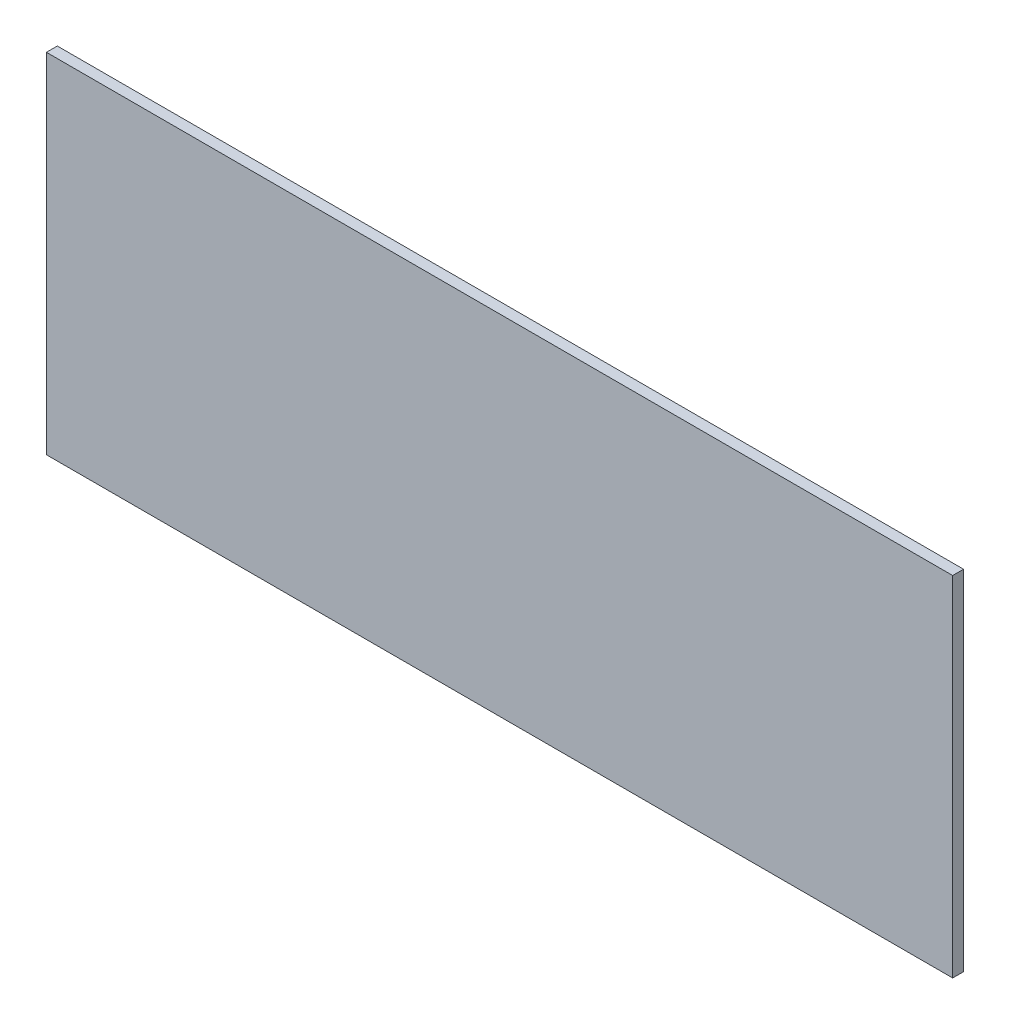
ISO-10303-21;
HEADER;
FILE_DESCRIPTION(('STEP AP214'),'2;1');
FILE_NAME('part.step','',(''),(''),'','','');
FILE_SCHEMA(('AUTOMOTIVE_DESIGN { 1 0 10303 214 1 1 1 1 }'));
ENDSEC;
DATA;
#1=APPLICATION_CONTEXT('core data for automotive mechanical design processes');
#2=APPLICATION_PROTOCOL_DEFINITION('international standard','automotive_design',2000,#1);
#3=PRODUCT_CONTEXT('',#1,'mechanical');
#4=PRODUCT('Part','Part','',(#3));
#5=PRODUCT_RELATED_PRODUCT_CATEGORY('part','',(#4));
#6=PRODUCT_DEFINITION_FORMATION('','',#4);
#7=PRODUCT_DEFINITION_CONTEXT('part definition',#1,'design');
#8=PRODUCT_DEFINITION('design','',#6,#7);
#9=PRODUCT_DEFINITION_SHAPE('','',#8);
#10=(LENGTH_UNIT() NAMED_UNIT(*) SI_UNIT(.MILLI.,.METRE.));
#11=(NAMED_UNIT(*) PLANE_ANGLE_UNIT() SI_UNIT($,.RADIAN.));
#12=(NAMED_UNIT(*) SI_UNIT($,.STERADIAN.) SOLID_ANGLE_UNIT());
#13=UNCERTAINTY_MEASURE_WITH_UNIT(LENGTH_MEASURE(1.E-05),#10,'distance_accuracy_value','');
#14=(GEOMETRIC_REPRESENTATION_CONTEXT(3) GLOBAL_UNCERTAINTY_ASSIGNED_CONTEXT((#13)) GLOBAL_UNIT_ASSIGNED_CONTEXT((#10,
#11,#12)) REPRESENTATION_CONTEXT('',''));
#15=CARTESIAN_POINT('',(0.,0.,0.));
#16=DIRECTION('',(0.,0.,1.));
#17=DIRECTION('',(1.,0.,0.));
#18=AXIS2_PLACEMENT_3D('',#15,#16,#17);
#19=CARTESIAN_POINT('',(416.,-160.,10.));
#20=DIRECTION('',(-1.,0.,0.));
#21=DIRECTION('',(0.,0.,1.));
#22=AXIS2_PLACEMENT_3D('',#19,#20,#21);
#23=PLANE('',#22);
#24=DIRECTION('',(0.,1.,0.));
#25=VECTOR('',#24,1.);
#26=CARTESIAN_POINT('',(416.,-160.,0.));
#27=LINE('',#26,#25);
#28=CARTESIAN_POINT('',(416.,-160.,0.));
#29=VERTEX_POINT('',#28);
#30=CARTESIAN_POINT('',(416.,160.,0.));
#31=VERTEX_POINT('',#30);
#32=EDGE_CURVE('E95',#29,#31,#27,.T.);
#33=ORIENTED_EDGE('',*,*,#32,.T.);
#34=DIRECTION('',(0.,0.,-1.));
#35=VECTOR('',#34,1.);
#36=CARTESIAN_POINT('',(416.,160.,10.));
#37=LINE('',#36,#35);
#38=CARTESIAN_POINT('',(416.,160.,10.));
#39=VERTEX_POINT('',#38);
#40=EDGE_CURVE('E11',#39,#31,#37,.T.);
#41=ORIENTED_EDGE('',*,*,#40,.F.);
#42=DIRECTION('',(0.,1.,0.));
#43=VECTOR('',#42,1.);
#44=CARTESIAN_POINT('',(416.,-160.,10.));
#45=LINE('',#44,#43);
#46=CARTESIAN_POINT('',(416.,-160.,10.));
#47=VERTEX_POINT('',#46);
#48=EDGE_CURVE('E83',#47,#39,#45,.T.);
#49=ORIENTED_EDGE('',*,*,#48,.F.);
#50=DIRECTION('',(0.,0.,-1.));
#51=VECTOR('',#50,1.);
#52=CARTESIAN_POINT('',(416.,-160.,10.));
#53=LINE('',#52,#51);
#54=EDGE_CURVE('E91',#47,#29,#53,.T.);
#55=ORIENTED_EDGE('',*,*,#54,.T.);
#56=EDGE_LOOP('',(#33,#41,#49,#55));
#57=FACE_BOUND('',#56,.T.);
#58=ADVANCED_FACE('F32',(#57),#23,.F.);
#59=CARTESIAN_POINT('',(-416.,160.,10.));
#60=DIRECTION('',(0.,-1.,0.));
#61=DIRECTION('',(0.,0.,-1.));
#62=AXIS2_PLACEMENT_3D('',#59,#60,#61);
#63=PLANE('',#62);
#64=DIRECTION('',(-1.,0.,0.));
#65=VECTOR('',#64,1.);
#66=CARTESIAN_POINT('',(-416.,160.,0.));
#67=LINE('',#66,#65);
#68=CARTESIAN_POINT('',(-416.,160.,0.));
#69=VERTEX_POINT('',#68);
#70=EDGE_CURVE('E87',#31,#69,#67,.T.);
#71=ORIENTED_EDGE('',*,*,#70,.T.);
#72=DIRECTION('',(0.,0.,-1.));
#73=VECTOR('',#72,1.);
#74=CARTESIAN_POINT('',(-416.,160.,10.));
#75=LINE('',#74,#73);
#76=CARTESIAN_POINT('',(-416.,160.,10.));
#77=VERTEX_POINT('',#76);
#78=EDGE_CURVE('E40',#77,#69,#75,.T.);
#79=ORIENTED_EDGE('',*,*,#78,.F.);
#80=DIRECTION('',(-1.,0.,0.));
#81=VECTOR('',#80,1.);
#82=CARTESIAN_POINT('',(-416.,160.,10.));
#83=LINE('',#82,#81);
#84=EDGE_CURVE('E78',#39,#77,#83,.T.);
#85=ORIENTED_EDGE('',*,*,#84,.F.);
#86=ORIENTED_EDGE('',*,*,#40,.T.);
#87=EDGE_LOOP('',(#71,#79,#85,#86));
#88=FACE_BOUND('',#87,.T.);
#89=ADVANCED_FACE('F86',(#88),#63,.F.);
#90=CARTESIAN_POINT('',(-416.,-160.,10.));
#91=DIRECTION('',(1.,0.,0.));
#92=DIRECTION('',(0.,0.,-1.));
#93=AXIS2_PLACEMENT_3D('',#90,#91,#92);
#94=PLANE('',#93);
#95=DIRECTION('',(0.,-1.,0.));
#96=VECTOR('',#95,1.);
#97=CARTESIAN_POINT('',(-416.,-160.,0.));
#98=LINE('',#97,#96);
#99=CARTESIAN_POINT('',(-416.,-160.,0.));
#100=VERTEX_POINT('',#99);
#101=EDGE_CURVE('E65',#69,#100,#98,.T.);
#102=ORIENTED_EDGE('',*,*,#101,.T.);
#103=DIRECTION('',(0.,0.,-1.));
#104=VECTOR('',#103,1.);
#105=CARTESIAN_POINT('',(-416.,-160.,10.));
#106=LINE('',#105,#104);
#107=CARTESIAN_POINT('',(-416.,-160.,10.));
#108=VERTEX_POINT('',#107);
#109=EDGE_CURVE('E88',#108,#100,#106,.T.);
#110=ORIENTED_EDGE('',*,*,#109,.F.);
#111=DIRECTION('',(0.,-1.,0.));
#112=VECTOR('',#111,1.);
#113=CARTESIAN_POINT('',(-416.,-160.,10.));
#114=LINE('',#113,#112);
#115=EDGE_CURVE('E81',#77,#108,#114,.T.);
#116=ORIENTED_EDGE('',*,*,#115,.F.);
#117=ORIENTED_EDGE('',*,*,#78,.T.);
#118=EDGE_LOOP('',(#102,#110,#116,#117));
#119=FACE_BOUND('',#118,.T.);
#120=ADVANCED_FACE('F89',(#119),#94,.F.);
#121=CARTESIAN_POINT('',(-416.,-160.,10.));
#122=DIRECTION('',(0.,1.,0.));
#123=DIRECTION('',(0.,0.,1.));
#124=AXIS2_PLACEMENT_3D('',#121,#122,#123);
#125=PLANE('',#124);
#126=DIRECTION('',(1.,0.,0.));
#127=VECTOR('',#126,1.);
#128=CARTESIAN_POINT('',(-416.,-160.,0.));
#129=LINE('',#128,#127);
#130=EDGE_CURVE('E71',#100,#29,#129,.T.);
#131=ORIENTED_EDGE('',*,*,#130,.T.);
#132=ORIENTED_EDGE('',*,*,#54,.F.);
#133=DIRECTION('',(1.,0.,0.));
#134=VECTOR('',#133,1.);
#135=CARTESIAN_POINT('',(-416.,-160.,10.));
#136=LINE('',#135,#134);
#137=EDGE_CURVE('E48',#108,#47,#136,.T.);
#138=ORIENTED_EDGE('',*,*,#137,.F.);
#139=ORIENTED_EDGE('',*,*,#109,.T.);
#140=EDGE_LOOP('',(#131,#132,#138,#139));
#141=FACE_BOUND('',#140,.T.);
#142=ADVANCED_FACE('F102',(#141),#125,.F.);
#143=CARTESIAN_POINT('',(0.,0.,10.));
#144=DIRECTION('',(0.,0.,-1.));
#145=DIRECTION('',(-1.,0.,0.));
#146=AXIS2_PLACEMENT_3D('',#143,#144,#145);
#147=PLANE('',#146);
#148=ORIENTED_EDGE('',*,*,#48,.T.);
#149=ORIENTED_EDGE('',*,*,#84,.T.);
#150=ORIENTED_EDGE('',*,*,#115,.T.);
#151=ORIENTED_EDGE('',*,*,#137,.T.);
#152=EDGE_LOOP('',(#148,#149,#150,#151));
#153=FACE_BOUND('',#152,.T.);
#154=ADVANCED_FACE('F79',(#153),#147,.F.);
#155=CARTESIAN_POINT('',(0.,0.,0.));
#156=DIRECTION('',(0.,0.,-1.));
#157=DIRECTION('',(-1.,0.,0.));
#158=AXIS2_PLACEMENT_3D('',#155,#156,#157);
#159=PLANE('',#158);
#160=ORIENTED_EDGE('',*,*,#32,.F.);
#161=ORIENTED_EDGE('',*,*,#130,.F.);
#162=ORIENTED_EDGE('',*,*,#101,.F.);
#163=ORIENTED_EDGE('',*,*,#70,.F.);
#164=EDGE_LOOP('',(#160,#161,#162,#163));
#165=FACE_BOUND('',#164,.T.);
#166=ADVANCED_FACE('F105',(#165),#159,.T.);
#167=CLOSED_SHELL('',(#58,#89,#120,#142,#154,#166));
#168=MANIFOLD_SOLID_BREP('B2',#167);
#169=ADVANCED_BREP_SHAPE_REPRESENTATION('',(#18,#168),#14);
#170=SHAPE_DEFINITION_REPRESENTATION(#9,#169);
ENDSEC;
END-ISO-10303-21;
